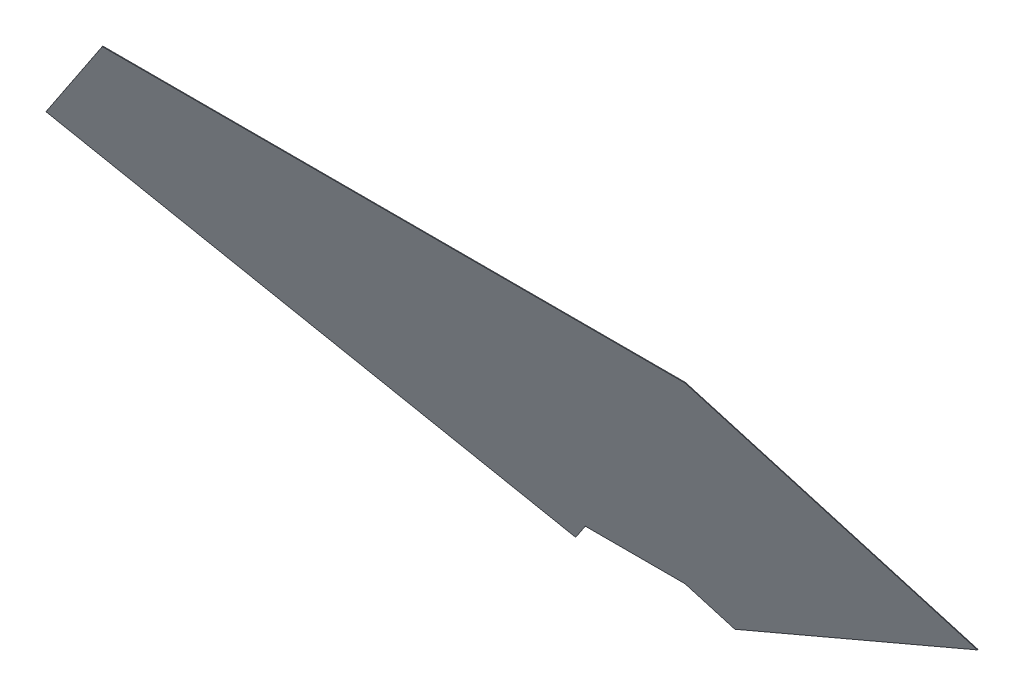
ISO-10303-21;
HEADER;
FILE_DESCRIPTION(('STEP AP214'),'2;1');
FILE_NAME('part.step','',(''),(''),'','','');
FILE_SCHEMA(('AUTOMOTIVE_DESIGN { 1 0 10303 214 1 1 1 1 }'));
ENDSEC;
DATA;
#1=APPLICATION_CONTEXT('core data for automotive mechanical design processes');
#2=APPLICATION_PROTOCOL_DEFINITION('international standard','automotive_design',2000,#1);
#3=PRODUCT_CONTEXT('',#1,'mechanical');
#4=PRODUCT('Part','Part','',(#3));
#5=PRODUCT_RELATED_PRODUCT_CATEGORY('part','',(#4));
#6=PRODUCT_DEFINITION_FORMATION('','',#4);
#7=PRODUCT_DEFINITION_CONTEXT('part definition',#1,'design');
#8=PRODUCT_DEFINITION('design','',#6,#7);
#9=PRODUCT_DEFINITION_SHAPE('','',#8);
#10=(LENGTH_UNIT() NAMED_UNIT(*) SI_UNIT(.MILLI.,.METRE.));
#11=(NAMED_UNIT(*) PLANE_ANGLE_UNIT() SI_UNIT($,.RADIAN.));
#12=(NAMED_UNIT(*) SI_UNIT($,.STERADIAN.) SOLID_ANGLE_UNIT());
#13=UNCERTAINTY_MEASURE_WITH_UNIT(LENGTH_MEASURE(1.E-05),#10,'distance_accuracy_value','');
#14=(GEOMETRIC_REPRESENTATION_CONTEXT(3) GLOBAL_UNCERTAINTY_ASSIGNED_CONTEXT((#13)) GLOBAL_UNIT_ASSIGNED_CONTEXT((#10,
#11,#12)) REPRESENTATION_CONTEXT('',''));
#15=CARTESIAN_POINT('',(0.,0.,0.));
#16=DIRECTION('',(0.,0.,1.));
#17=DIRECTION('',(1.,0.,0.));
#18=AXIS2_PLACEMENT_3D('',#15,#16,#17);
#19=CARTESIAN_POINT('',(243.,-418.,-243.));
#20=DIRECTION('',(0.,-0.864528085785323,-0.502584509200559));
#21=DIRECTION('',(1.,0.,0.));
#22=AXIS2_PLACEMENT_3D('',#19,#20,#21);
#23=PLANE('',#22);
#24=DIRECTION('',(0.,-0.502584509200558,0.864528085785322));
#25=VECTOR('',#24,1.);
#26=CARTESIAN_POINT('',(243.063681138799,-418.,-243.));
#27=LINE('',#26,#25);
#28=CARTESIAN_POINT('',(243.063681138799,-418.,-243.));
#29=VERTEX_POINT('',#28);
#30=CARTESIAN_POINT('',(243.063681138799,-418.2512922546,-242.567735957107));
#31=VERTEX_POINT('',#30);
#32=EDGE_CURVE('E51',#29,#31,#27,.T.);
#33=ORIENTED_EDGE('',*,*,#32,.F.);
#34=DIRECTION('',(1.,0.,0.));
#35=VECTOR('',#34,1.);
#36=CARTESIAN_POINT('',(243.,-418.,-243.));
#37=LINE('',#36,#35);
#38=CARTESIAN_POINT('',(342.936318861201,-418.,-243.));
#39=VERTEX_POINT('',#38);
#40=EDGE_CURVE('E211',#29,#39,#37,.T.);
#41=ORIENTED_EDGE('',*,*,#40,.T.);
#42=DIRECTION('',(-5.652099297238E-13,-0.502584509200287,0.86452808578548));
#43=VECTOR('',#42,1.);
#44=CARTESIAN_POINT('',(342.936318861201,-418.,-243.));
#45=LINE('',#44,#43);
#46=CARTESIAN_POINT('',(342.936318861201,-418.2512922546,-242.567735957107));
#47=VERTEX_POINT('',#46);
#48=EDGE_CURVE('E219',#39,#47,#45,.T.);
#49=ORIENTED_EDGE('',*,*,#48,.T.);
#50=DIRECTION('',(1.,0.,0.));
#51=VECTOR('',#50,1.);
#52=CARTESIAN_POINT('',(0.,-418.2512922546,-242.567735957107));
#53=LINE('',#52,#51);
#54=EDGE_CURVE('E210',#31,#47,#53,.T.);
#55=ORIENTED_EDGE('',*,*,#54,.F.);
#56=EDGE_LOOP('',(#33,#41,#49,#55));
#57=FACE_BOUND('',#56,.T.);
#58=ADVANCED_FACE('F43',(#57),#23,.T.);
#59=CARTESIAN_POINT('',(586.,0.,0.));
#60=DIRECTION('',(0.,0.864528085785323,0.502584509200559));
#61=DIRECTION('',(-1.,0.,0.));
#62=AXIS2_PLACEMENT_3D('',#59,#60,#61);
#63=PLANE('',#62);
#64=DIRECTION('',(0.,-0.502584509200558,0.864528085785322));
#65=VECTOR('',#64,1.);
#66=CARTESIAN_POINT('',(585.936318861201,0.,0.));
#67=LINE('',#66,#65);
#68=CARTESIAN_POINT('',(585.936318861201,0.,0.));
#69=VERTEX_POINT('',#68);
#70=CARTESIAN_POINT('',(585.936318861201,-0.251292254600216,0.432264042892691));
#71=VERTEX_POINT('',#70);
#72=EDGE_CURVE('E213',#69,#71,#67,.T.);
#73=ORIENTED_EDGE('',*,*,#72,.F.);
#74=DIRECTION('',(-1.,0.,0.));
#75=VECTOR('',#74,1.);
#76=CARTESIAN_POINT('',(586.,0.,0.));
#77=LINE('',#76,#75);
#78=CARTESIAN_POINT('',(0.0636811387989683,1.11022302462516E-13,0.));
#79=VERTEX_POINT('',#78);
#80=EDGE_CURVE('E204',#69,#79,#77,.T.);
#81=ORIENTED_EDGE('',*,*,#80,.T.);
#82=DIRECTION('',(0.,-0.502584509200523,0.864528085785343));
#83=VECTOR('',#82,1.);
#84=CARTESIAN_POINT('',(0.0636811387989544,0.,0.));
#85=LINE('',#84,#83);
#86=CARTESIAN_POINT('',(0.0636811387989544,-0.251292254600279,0.432264042892661));
#87=VERTEX_POINT('',#86);
#88=EDGE_CURVE('E12',#79,#87,#85,.T.);
#89=ORIENTED_EDGE('',*,*,#88,.T.);
#90=DIRECTION('',(1.,0.,0.));
#91=VECTOR('',#90,1.);
#92=CARTESIAN_POINT('',(0.,-0.251292254600279,0.432264042892661));
#93=LINE('',#92,#91);
#94=EDGE_CURVE('E208',#71,#87,#93,.F.);
#95=ORIENTED_EDGE('',*,*,#94,.F.);
#96=EDGE_LOOP('',(#73,#81,#89,#95));
#97=FACE_BOUND('',#96,.T.);
#98=ADVANCED_FACE('F252',(#97),#63,.T.);
#99=CARTESIAN_POINT('',(0.,-0.251292254600279,0.432264042892661));
#100=DIRECTION('',(0.,-0.502584509200558,0.864528085785322));
#101=DIRECTION('',(0.,-0.864528085785323,-0.502584509200559));
#102=AXIS2_PLACEMENT_3D('',#99,#100,#101);
#103=PLANE('',#102);
#104=ORIENTED_EDGE('',*,*,#54,.T.);
#105=DIRECTION('',(-0.893501577895074,0.38822502715512,0.22569062583417));
#106=VECTOR('',#105,1.);
#107=CARTESIAN_POINT('',(343.316731606374,-418.416580992728,-242.663824864679));
#108=LINE('',#107,#106);
#109=CARTESIAN_POINT('',(343.316731606375,-418.416580992728,-242.663824864679));
#110=VERTEX_POINT('',#109);
#111=EDGE_CURVE('E66',#110,#47,#108,.T.);
#112=ORIENTED_EDGE('',*,*,#111,.F.);
#113=DIRECTION('',(-0.596690139402094,0.693759348683036,0.403309860597531));
#114=VECTOR('',#113,1.);
#115=CARTESIAN_POINT('',(198.283029824078,-249.788879877373,-144.633845508267));
#116=LINE('',#115,#114);
#117=CARTESIAN_POINT('',(373.113240668892,-453.060369041503,-262.803634663344));
#118=VERTEX_POINT('',#117);
#119=EDGE_CURVE('E179',#110,#118,#116,.F.);
#120=ORIENTED_EDGE('',*,*,#119,.T.);
#121=DIRECTION('',(-0.803951859260886,-0.514129995703888,-0.298884184105624));
#122=VECTOR('',#121,1.);
#123=CARTESIAN_POINT('',(761.82578808437,-204.477350007878,-118.29245374176));
#124=LINE('',#123,#122);
#125=CARTESIAN_POINT('',(761.82578808437,-204.477350007878,-118.29245374176));
#126=VERTEX_POINT('',#125);
#127=EDGE_CURVE('E192',#126,#118,#124,.T.);
#128=ORIENTED_EDGE('',*,*,#127,.F.);
#129=DIRECTION('',(-0.596690139402094,0.693759348683036,0.403309860597531));
#130=VECTOR('',#129,1.);
#131=CARTESIAN_POINT('',(586.278733698788,-0.372401607351122,0.361858366532575));
#132=LINE('',#131,#130);
#133=CARTESIAN_POINT('',(586.316731606375,-0.416580992727636,0.336175135320915));
#134=VERTEX_POINT('',#133);
#135=EDGE_CURVE('E182',#126,#134,#132,.T.);
#136=ORIENTED_EDGE('',*,*,#135,.T.);
#137=DIRECTION('',(0.893501577895097,-0.388225027155082,-0.225690625834143));
#138=VECTOR('',#137,1.);
#139=CARTESIAN_POINT('',(585.936318861201,-0.251292254600206,0.432264042892697));
#140=LINE('',#139,#138);
#141=EDGE_CURVE('E175',#71,#134,#140,.T.);
#142=ORIENTED_EDGE('',*,*,#141,.F.);
#143=ORIENTED_EDGE('',*,*,#94,.T.);
#144=DIRECTION('',(0.893501577895154,0.388225027154988,0.225690625834083));
#145=VECTOR('',#144,1.);
#146=CARTESIAN_POINT('',(-0.316731606374854,-0.416580992727695,0.336175135320949));
#147=LINE('',#146,#145);
#148=CARTESIAN_POINT('',(-0.316731606374877,-0.416580992727712,0.336175135320976));
#149=VERTEX_POINT('',#148);
#150=EDGE_CURVE('E58',#149,#87,#147,.T.);
#151=ORIENTED_EDGE('',*,*,#150,.F.);
#152=DIRECTION('',(0.596690139402094,0.69375934868281,0.40330986059792));
#153=VECTOR('',#152,1.);
#154=CARTESIAN_POINT('',(-0.27873369878765,-0.372401607351175,0.361858366532696));
#155=LINE('',#154,#153);
#156=CARTESIAN_POINT('',(-175.108944543601,-203.643890771414,-117.807930788658));
#157=VERTEX_POINT('',#156);
#158=EDGE_CURVE('E137',#149,#157,#155,.F.);
#159=ORIENTED_EDGE('',*,*,#158,.T.);
#160=DIRECTION('',(0.802471730056773,-0.515855384024274,-0.299887220856207));
#161=VECTOR('',#160,1.);
#162=CARTESIAN_POINT('',(-175.108944543601,-203.643890771414,-117.807930788658));
#163=LINE('',#162,#161);
#164=CARTESIAN_POINT('',(212.886759331108,-453.060369041492,-262.803634663363));
#165=VERTEX_POINT('',#164);
#166=EDGE_CURVE('E148',#165,#157,#163,.F.);
#167=ORIENTED_EDGE('',*,*,#166,.F.);
#168=DIRECTION('',(0.596690139402094,0.69375934868281,0.40330986059792));
#169=VECTOR('',#168,1.);
#170=CARTESIAN_POINT('',(387.716970175921,-249.788879877429,-144.633845508173));
#171=LINE('',#170,#169);
#172=CARTESIAN_POINT('',(242.683268393625,-418.416580992728,-242.663824864679));
#173=VERTEX_POINT('',#172);
#174=EDGE_CURVE('E150',#165,#173,#171,.T.);
#175=ORIENTED_EDGE('',*,*,#174,.T.);
#176=DIRECTION('',(-0.89350157789503,-0.388225027155209,-0.22569062583419));
#177=VECTOR('',#176,1.);
#178=CARTESIAN_POINT('',(243.063681138799,-418.2512922546,-242.567735957107));
#179=LINE('',#178,#177);
#180=EDGE_CURVE('E143',#31,#173,#179,.T.);
#181=ORIENTED_EDGE('',*,*,#180,.F.);
#182=EDGE_LOOP('',(#104,#112,#120,#128,#136,#142,#143,#151,#159,#167,#175,#181));
#183=FACE_BOUND('',#182,.T.);
#184=ADVANCED_FACE('F147',(#183),#103,.T.);
#185=CARTESIAN_POINT('',(0.,0.,0.));
#186=DIRECTION('',(0.,-0.502584509200558,0.864528085785322));
#187=DIRECTION('',(0.,-0.864528085785323,-0.502584509200559));
#188=AXIS2_PLACEMENT_3D('',#185,#186,#187);
#189=PLANE('',#188);
#190=ORIENTED_EDGE('',*,*,#40,.F.);
#191=DIRECTION('',(-0.89350157789503,-0.388225027155209,-0.22569062583419));
#192=VECTOR('',#191,1.);
#193=CARTESIAN_POINT('',(243.063681138799,-418.,-243.));
#194=LINE('',#193,#192);
#195=CARTESIAN_POINT('',(242.683268393625,-418.165288738128,-243.096088907572));
#196=VERTEX_POINT('',#195);
#197=EDGE_CURVE('E163',#29,#196,#194,.T.);
#198=ORIENTED_EDGE('',*,*,#197,.T.);
#199=DIRECTION('',(0.596690139402094,0.693759348682809,0.40330986059792));
#200=VECTOR('',#199,1.);
#201=CARTESIAN_POINT('',(212.886759331108,-452.809076786891,-263.235898706256));
#202=LINE('',#201,#200);
#203=CARTESIAN_POINT('',(212.886759331108,-452.809076786891,-263.235898706256));
#204=VERTEX_POINT('',#203);
#205=EDGE_CURVE('E156',#204,#196,#202,.T.);
#206=ORIENTED_EDGE('',*,*,#205,.F.);
#207=DIRECTION('',(-0.802471730056773,0.515855384024274,0.299887220856207));
#208=VECTOR('',#207,1.);
#209=CARTESIAN_POINT('',(212.886759331108,-452.809076786891,-263.235898706256));
#210=LINE('',#209,#208);
#211=CARTESIAN_POINT('',(-175.108944543601,-203.392598516814,-118.24019483155));
#212=VERTEX_POINT('',#211);
#213=EDGE_CURVE('E154',#204,#212,#210,.T.);
#214=ORIENTED_EDGE('',*,*,#213,.T.);
#215=DIRECTION('',(-0.596690139402094,-0.69375934868281,-0.40330986059792));
#216=VECTOR('',#215,1.);
#217=CARTESIAN_POINT('',(-0.278733698787642,-0.121109352750892,-0.0704056763599636));
#218=LINE('',#217,#216);
#219=CARTESIAN_POINT('',(-0.31673160637487,-0.165288738127429,-0.0960889075716837));
#220=VERTEX_POINT('',#219);
#221=EDGE_CURVE('E138',#220,#212,#218,.T.);
#222=ORIENTED_EDGE('',*,*,#221,.F.);
#223=DIRECTION('',(0.893501577895154,0.388225027154988,0.225690625834083));
#224=VECTOR('',#223,1.);
#225=CARTESIAN_POINT('',(-0.316731606374854,-0.165288738127416,-0.0960889075717123));
#226=LINE('',#225,#224);
#227=EDGE_CURVE('E166',#220,#79,#226,.T.);
#228=ORIENTED_EDGE('',*,*,#227,.T.);
#229=ORIENTED_EDGE('',*,*,#80,.F.);
#230=DIRECTION('',(0.893501577895097,-0.388225027155082,-0.225690625834143));
#231=VECTOR('',#230,1.);
#232=CARTESIAN_POINT('',(585.936318861201,0.,0.));
#233=LINE('',#232,#231);
#234=CARTESIAN_POINT('',(586.316731606375,-0.165288738127323,-0.0960889075716231));
#235=VERTEX_POINT('',#234);
#236=EDGE_CURVE('E198',#69,#235,#233,.T.);
#237=ORIENTED_EDGE('',*,*,#236,.T.);
#238=DIRECTION('',(-0.596690139402094,0.693759348683036,0.403309860597531));
#239=VECTOR('',#238,1.);
#240=CARTESIAN_POINT('',(761.82578808437,-204.226057753277,-118.724717784652));
#241=LINE('',#240,#239);
#242=CARTESIAN_POINT('',(761.82578808437,-204.226057753277,-118.724717784652));
#243=VERTEX_POINT('',#242);
#244=EDGE_CURVE('E187',#243,#235,#241,.T.);
#245=ORIENTED_EDGE('',*,*,#244,.F.);
#246=DIRECTION('',(-0.803951859260886,-0.514129995703888,-0.298884184105624));
#247=VECTOR('',#246,1.);
#248=CARTESIAN_POINT('',(761.82578808437,-204.226057753277,-118.724717784652));
#249=LINE('',#248,#247);
#250=CARTESIAN_POINT('',(373.113240668892,-452.809076786903,-263.235898706237));
#251=VERTEX_POINT('',#250);
#252=EDGE_CURVE('E189',#243,#251,#249,.T.);
#253=ORIENTED_EDGE('',*,*,#252,.T.);
#254=DIRECTION('',(0.596690139402094,-0.693759348683036,-0.403309860597531));
#255=VECTOR('',#254,1.);
#256=CARTESIAN_POINT('',(343.278733698788,-418.121109352751,-243.07040567636));
#257=LINE('',#256,#255);
#258=CARTESIAN_POINT('',(343.316731606375,-418.165288738128,-243.096088907572));
#259=VERTEX_POINT('',#258);
#260=EDGE_CURVE('E176',#259,#251,#257,.T.);
#261=ORIENTED_EDGE('',*,*,#260,.F.);
#262=DIRECTION('',(-0.893501577895074,0.38822502715512,0.22569062583417));
#263=VECTOR('',#262,1.);
#264=CARTESIAN_POINT('',(343.316731606374,-418.165288738128,-243.096088907572));
#265=LINE('',#264,#263);
#266=EDGE_CURVE('E201',#259,#39,#265,.T.);
#267=ORIENTED_EDGE('',*,*,#266,.T.);
#268=EDGE_LOOP('',(#190,#198,#206,#214,#222,#228,#229,#237,#245,#253,#261,#267));
#269=FACE_BOUND('',#268,.T.);
#270=ADVANCED_FACE('F45',(#269),#189,.F.);
#271=CARTESIAN_POINT('',(585.936318861201,-0.125646127300066,0.216132021446366));
#272=DIRECTION('',(0.449060051996357,0.772457208783814,0.449060051996332));
#273=DIRECTION('',(0.893501577895097,-0.388225027155082,-0.225690625834143));
#274=AXIS2_PLACEMENT_3D('',#271,#272,#273);
#275=PLANE('',#274);
#276=ORIENTED_EDGE('',*,*,#72,.T.);
#277=ORIENTED_EDGE('',*,*,#141,.T.);
#278=DIRECTION('',(-5.50243163022926E-13,-0.502584509200038,0.864528085785625));
#279=VECTOR('',#278,1.);
#280=CARTESIAN_POINT('',(586.316731606375,-0.165288738127517,-0.0960889075717342));
#281=LINE('',#280,#279);
#282=EDGE_CURVE('E184',#235,#134,#281,.T.);
#283=ORIENTED_EDGE('',*,*,#282,.F.);
#284=ORIENTED_EDGE('',*,*,#236,.F.);
#285=EDGE_LOOP('',(#276,#277,#283,#284));
#286=FACE_BOUND('',#285,.T.);
#287=ADVANCED_FACE('F248',(#286),#275,.T.);
#288=CARTESIAN_POINT('',(343.316731606374,-418.290934865428,-242.879956886125));
#289=DIRECTION('',(-0.449060051996404,-0.772457208783794,-0.44906005199632));
#290=DIRECTION('',(-0.893501577895074,0.38822502715512,0.22569062583417));
#291=AXIS2_PLACEMENT_3D('',#288,#289,#290);
#292=PLANE('',#291);
#293=ORIENTED_EDGE('',*,*,#111,.T.);
#294=ORIENTED_EDGE('',*,*,#48,.F.);
#295=ORIENTED_EDGE('',*,*,#266,.F.);
#296=DIRECTION('',(-4.34319247233361E-13,-0.50258450920037,0.864528085785432));
#297=VECTOR('',#296,1.);
#298=CARTESIAN_POINT('',(343.316731606375,-418.165288738128,-243.096088907572));
#299=LINE('',#298,#297);
#300=EDGE_CURVE('E169',#259,#110,#299,.T.);
#301=ORIENTED_EDGE('',*,*,#300,.T.);
#302=EDGE_LOOP('',(#293,#294,#295,#301));
#303=FACE_BOUND('',#302,.T.);
#304=ADVANCED_FACE('F231',(#303),#292,.T.);
#305=CARTESIAN_POINT('',(761.82578808437,-204.226057753277,-118.724717784652));
#306=DIRECTION('',(-0.594694382007233,0.695038961950583,0.404053750607134));
#307=DIRECTION('',(-0.803951859260886,-0.514129995703888,-0.298884184105624));
#308=AXIS2_PLACEMENT_3D('',#305,#306,#307);
#309=PLANE('',#308);
#310=DIRECTION('',(-4.34319247233361E-13,-0.50258450920037,0.864528085785432));
#311=VECTOR('',#310,1.);
#312=CARTESIAN_POINT('',(373.113240668892,-452.809076786903,-263.235898706237));
#313=LINE('',#312,#311);
#314=EDGE_CURVE('E173',#251,#118,#313,.T.);
#315=ORIENTED_EDGE('',*,*,#314,.F.);
#316=ORIENTED_EDGE('',*,*,#252,.F.);
#317=DIRECTION('',(-4.34319247233361E-13,-0.50258450920037,0.864528085785432));
#318=VECTOR('',#317,1.);
#319=CARTESIAN_POINT('',(761.82578808437,-204.226057753277,-118.724717784652));
#320=LINE('',#319,#318);
#321=EDGE_CURVE('E195',#243,#126,#320,.T.);
#322=ORIENTED_EDGE('',*,*,#321,.T.);
#323=ORIENTED_EDGE('',*,*,#127,.T.);
#324=EDGE_LOOP('',(#315,#316,#322,#323));
#325=FACE_BOUND('',#324,.T.);
#326=ADVANCED_FACE('F241',(#325),#309,.F.);
#327=CARTESIAN_POINT('',(761.82578808437,-204.226057753277,-118.724717784652));
#328=DIRECTION('',(0.802471730056773,0.51585538402416,0.299887220856403));
#329=DIRECTION('',(-0.596690139402094,0.693759348683036,0.403309860597531));
#330=AXIS2_PLACEMENT_3D('',#327,#328,#329);
#331=PLANE('',#330);
#332=ORIENTED_EDGE('',*,*,#321,.F.);
#333=ORIENTED_EDGE('',*,*,#244,.T.);
#334=ORIENTED_EDGE('',*,*,#282,.T.);
#335=ORIENTED_EDGE('',*,*,#135,.F.);
#336=EDGE_LOOP('',(#332,#333,#334,#335));
#337=FACE_BOUND('',#336,.T.);
#338=ADVANCED_FACE('F243',(#337),#331,.T.);
#339=CARTESIAN_POINT('',(343.278733698788,-418.121109352751,-243.07040567636));
#340=DIRECTION('',(-0.802471730056773,-0.51585538402416,-0.299887220856403));
#341=DIRECTION('',(0.596690139402094,-0.693759348683036,-0.403309860597531));
#342=AXIS2_PLACEMENT_3D('',#339,#340,#341);
#343=PLANE('',#342);
#344=ORIENTED_EDGE('',*,*,#300,.F.);
#345=ORIENTED_EDGE('',*,*,#260,.T.);
#346=ORIENTED_EDGE('',*,*,#314,.T.);
#347=ORIENTED_EDGE('',*,*,#119,.F.);
#348=EDGE_LOOP('',(#344,#345,#346,#347));
#349=FACE_BOUND('',#348,.T.);
#350=ADVANCED_FACE('F237',(#349),#343,.T.);
#351=CARTESIAN_POINT('',(243.063681138799,-418.1256461273,-242.783867978554));
#352=DIRECTION('',(0.449060051996491,-0.772457208783756,-0.449060051996298));
#353=DIRECTION('',(-0.89350157789503,-0.388225027155209,-0.22569062583419));
#354=AXIS2_PLACEMENT_3D('',#351,#352,#353);
#355=PLANE('',#354);
#356=ORIENTED_EDGE('',*,*,#32,.T.);
#357=ORIENTED_EDGE('',*,*,#180,.T.);
#358=DIRECTION('',(-1.01857972903672E-12,-0.502584509198703,0.864528085786401));
#359=VECTOR('',#358,1.);
#360=CARTESIAN_POINT('',(242.683268393625,-418.165288738128,-243.096088907572));
#361=LINE('',#360,#359);
#362=EDGE_CURVE('E259',#196,#173,#361,.T.);
#363=ORIENTED_EDGE('',*,*,#362,.F.);
#364=ORIENTED_EDGE('',*,*,#197,.F.);
#365=EDGE_LOOP('',(#356,#357,#363,#364));
#366=FACE_BOUND('',#365,.T.);
#367=ADVANCED_FACE('F224',(#366),#355,.T.);
#368=CARTESIAN_POINT('',(-0.316731606374854,-0.290934865427556,0.120043113874618));
#369=DIRECTION('',(-0.449060051996245,0.772457208783863,0.44906005199636));
#370=DIRECTION('',(0.893501577895154,0.388225027154988,0.225690625834083));
#371=AXIS2_PLACEMENT_3D('',#368,#369,#370);
#372=PLANE('',#371);
#373=ORIENTED_EDGE('',*,*,#150,.T.);
#374=ORIENTED_EDGE('',*,*,#88,.F.);
#375=ORIENTED_EDGE('',*,*,#227,.F.);
#376=DIRECTION('',(0.,-0.502584509200565,0.864528085785318));
#377=VECTOR('',#376,1.);
#378=CARTESIAN_POINT('',(-0.31673160637487,-0.165288738127429,-0.0960889075716837));
#379=LINE('',#378,#377);
#380=EDGE_CURVE('E158',#220,#149,#379,.T.);
#381=ORIENTED_EDGE('',*,*,#380,.T.);
#382=EDGE_LOOP('',(#373,#374,#375,#381));
#383=FACE_BOUND('',#382,.T.);
#384=ADVANCED_FACE('F254',(#383),#372,.T.);
#385=CARTESIAN_POINT('',(212.886759331108,-452.809076786891,-263.235898706256));
#386=DIRECTION('',(0.596690139402094,0.69375934868281,0.40330986059792));
#387=DIRECTION('',(-0.802471730056773,0.515855384024274,0.299887220856207));
#388=AXIS2_PLACEMENT_3D('',#385,#386,#387);
#389=PLANE('',#388);
#390=DIRECTION('',(0.,-0.502584509200565,0.864528085785318));
#391=VECTOR('',#390,1.);
#392=CARTESIAN_POINT('',(-175.108944543601,-203.392598516814,-118.24019483155));
#393=LINE('',#392,#391);
#394=EDGE_CURVE('E133',#212,#157,#393,.T.);
#395=ORIENTED_EDGE('',*,*,#394,.F.);
#396=ORIENTED_EDGE('',*,*,#213,.F.);
#397=DIRECTION('',(0.,-0.502584509200565,0.864528085785318));
#398=VECTOR('',#397,1.);
#399=CARTESIAN_POINT('',(212.886759331108,-452.809076786891,-263.235898706256));
#400=LINE('',#399,#398);
#401=EDGE_CURVE('E153',#204,#165,#400,.T.);
#402=ORIENTED_EDGE('',*,*,#401,.T.);
#403=ORIENTED_EDGE('',*,*,#166,.T.);
#404=EDGE_LOOP('',(#395,#396,#402,#403));
#405=FACE_BOUND('',#404,.T.);
#406=ADVANCED_FACE('F152',(#405),#389,.F.);
#407=CARTESIAN_POINT('',(212.886759331108,-452.809076786891,-263.235898706256));
#408=DIRECTION('',(0.802471730056773,-0.515855384024274,-0.299887220856207));
#409=DIRECTION('',(0.596690139402094,0.693759348682809,0.40330986059792));
#410=AXIS2_PLACEMENT_3D('',#407,#408,#409);
#411=PLANE('',#410);
#412=ORIENTED_EDGE('',*,*,#401,.F.);
#413=ORIENTED_EDGE('',*,*,#205,.T.);
#414=ORIENTED_EDGE('',*,*,#362,.T.);
#415=ORIENTED_EDGE('',*,*,#174,.F.);
#416=EDGE_LOOP('',(#412,#413,#414,#415));
#417=FACE_BOUND('',#416,.T.);
#418=ADVANCED_FACE('F261',(#417),#411,.T.);
#419=CARTESIAN_POINT('',(-0.278733698787642,-0.121109352750892,-0.0704056763599636));
#420=DIRECTION('',(-0.802471730056773,0.515855384024274,0.299887220856207));
#421=DIRECTION('',(-0.596690139402094,-0.69375934868281,-0.40330986059792));
#422=AXIS2_PLACEMENT_3D('',#419,#420,#421);
#423=PLANE('',#422);
#424=ORIENTED_EDGE('',*,*,#380,.F.);
#425=ORIENTED_EDGE('',*,*,#221,.T.);
#426=ORIENTED_EDGE('',*,*,#394,.T.);
#427=ORIENTED_EDGE('',*,*,#158,.F.);
#428=EDGE_LOOP('',(#424,#425,#426,#427));
#429=FACE_BOUND('',#428,.T.);
#430=ADVANCED_FACE('F136',(#429),#423,.T.);
#431=CLOSED_SHELL('',(#58,#98,#184,#270,#287,#304,#326,#338,#350,#367,#384,#406,#418,#430));
#432=MANIFOLD_SOLID_BREP('B2',#431);
#433=ADVANCED_BREP_SHAPE_REPRESENTATION('',(#18,#432),#14);
#434=SHAPE_DEFINITION_REPRESENTATION(#9,#433);
ENDSEC;
END-ISO-10303-21;
